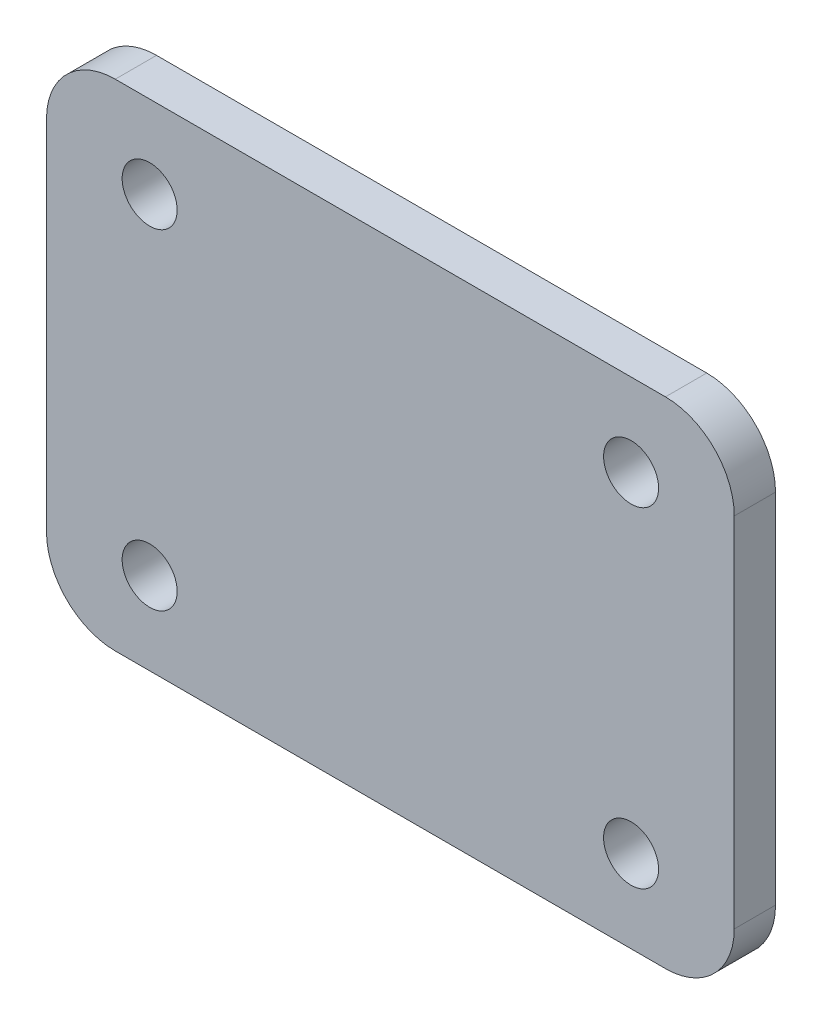
ISO-10303-21;
HEADER;
FILE_DESCRIPTION(('STEP AP214'),'2;1');
FILE_NAME('part.step','',(''),(''),'','','');
FILE_SCHEMA(('AUTOMOTIVE_DESIGN { 1 0 10303 214 1 1 1 1 }'));
ENDSEC;
DATA;
#1=APPLICATION_CONTEXT('core data for automotive mechanical design processes');
#2=APPLICATION_PROTOCOL_DEFINITION('international standard','automotive_design',2000,#1);
#3=PRODUCT_CONTEXT('',#1,'mechanical');
#4=PRODUCT('Part','Part','',(#3));
#5=PRODUCT_RELATED_PRODUCT_CATEGORY('part','',(#4));
#6=PRODUCT_DEFINITION_FORMATION('','',#4);
#7=PRODUCT_DEFINITION_CONTEXT('part definition',#1,'design');
#8=PRODUCT_DEFINITION('design','',#6,#7);
#9=PRODUCT_DEFINITION_SHAPE('','',#8);
#10=(LENGTH_UNIT() NAMED_UNIT(*) SI_UNIT(.MILLI.,.METRE.));
#11=(NAMED_UNIT(*) PLANE_ANGLE_UNIT() SI_UNIT($,.RADIAN.));
#12=(NAMED_UNIT(*) SI_UNIT($,.STERADIAN.) SOLID_ANGLE_UNIT());
#13=UNCERTAINTY_MEASURE_WITH_UNIT(LENGTH_MEASURE(1.E-05),#10,'distance_accuracy_value','');
#14=(GEOMETRIC_REPRESENTATION_CONTEXT(3) GLOBAL_UNCERTAINTY_ASSIGNED_CONTEXT((#13)) GLOBAL_UNIT_ASSIGNED_CONTEXT((#10,
#11,#12)) REPRESENTATION_CONTEXT('',''));
#15=CARTESIAN_POINT('',(0.,0.,0.));
#16=DIRECTION('',(0.,0.,1.));
#17=DIRECTION('',(1.,0.,0.));
#18=AXIS2_PLACEMENT_3D('',#15,#16,#17);
#19=CARTESIAN_POINT('',(0.,0.,3.));
#20=DIRECTION('',(0.,0.,1.));
#21=DIRECTION('',(1.,0.,0.));
#22=AXIS2_PLACEMENT_3D('',#19,#20,#21);
#23=PLANE('',#22);
#24=CARTESIAN_POINT('',(17.5,12.,3.));
#25=DIRECTION('',(0.,0.,1.));
#26=DIRECTION('',(1.,0.,0.));
#27=AXIS2_PLACEMENT_3D('',#24,#25,#26);
#28=CIRCLE('',#27,2.);
#29=CARTESIAN_POINT('',(19.5,12.,3.));
#30=VERTEX_POINT('',#29);
#31=EDGE_CURVE('E194',#30,#30,#28,.T.);
#32=ORIENTED_EDGE('',*,*,#31,.F.);
#33=EDGE_LOOP('',(#32));
#34=FACE_BOUND('',#33,.T.);
#35=CARTESIAN_POINT('',(17.5,-12.,3.));
#36=DIRECTION('',(0.,0.,1.));
#37=DIRECTION('',(1.,0.,0.));
#38=AXIS2_PLACEMENT_3D('',#35,#36,#37);
#39=CIRCLE('',#38,2.);
#40=CARTESIAN_POINT('',(19.5,-12.,3.));
#41=VERTEX_POINT('',#40);
#42=EDGE_CURVE('E135',#41,#41,#39,.T.);
#43=ORIENTED_EDGE('',*,*,#42,.F.);
#44=EDGE_LOOP('',(#43));
#45=FACE_BOUND('',#44,.T.);
#46=DIRECTION('',(1.,0.,0.));
#47=VECTOR('',#46,1.);
#48=CARTESIAN_POINT('',(-25.,-18.,3.));
#49=LINE('',#48,#47);
#50=CARTESIAN_POINT('',(-20.,-18.,3.));
#51=VERTEX_POINT('',#50);
#52=CARTESIAN_POINT('',(20.,-18.,3.));
#53=VERTEX_POINT('',#52);
#54=EDGE_CURVE('E144',#51,#53,#49,.T.);
#55=ORIENTED_EDGE('',*,*,#54,.T.);
#56=CARTESIAN_POINT('',(20.,-13.,3.));
#57=DIRECTION('',(0.,0.,1.));
#58=DIRECTION('',(1.,0.,0.));
#59=AXIS2_PLACEMENT_3D('',#56,#57,#58);
#60=CIRCLE('',#59,5.);
#61=CARTESIAN_POINT('',(25.,-13.,3.));
#62=VERTEX_POINT('',#61);
#63=EDGE_CURVE('E163',#53,#62,#60,.T.);
#64=ORIENTED_EDGE('',*,*,#63,.T.);
#65=DIRECTION('',(0.,1.,0.));
#66=VECTOR('',#65,1.);
#67=CARTESIAN_POINT('',(25.,-18.,3.));
#68=LINE('',#67,#66);
#69=CARTESIAN_POINT('',(25.,13.,3.));
#70=VERTEX_POINT('',#69);
#71=EDGE_CURVE('E127',#62,#70,#68,.T.);
#72=ORIENTED_EDGE('',*,*,#71,.T.);
#73=CARTESIAN_POINT('',(20.,13.,3.));
#74=DIRECTION('',(0.,0.,1.));
#75=DIRECTION('',(1.,0.,0.));
#76=AXIS2_PLACEMENT_3D('',#73,#74,#75);
#77=CIRCLE('',#76,5.);
#78=CARTESIAN_POINT('',(20.,18.,3.));
#79=VERTEX_POINT('',#78);
#80=EDGE_CURVE('E158',#70,#79,#77,.T.);
#81=ORIENTED_EDGE('',*,*,#80,.T.);
#82=DIRECTION('',(-1.,0.,0.));
#83=VECTOR('',#82,1.);
#84=CARTESIAN_POINT('',(25.,18.,3.));
#85=LINE('',#84,#83);
#86=CARTESIAN_POINT('',(-20.,18.,3.));
#87=VERTEX_POINT('',#86);
#88=EDGE_CURVE('E174',#79,#87,#85,.T.);
#89=ORIENTED_EDGE('',*,*,#88,.T.);
#90=CARTESIAN_POINT('',(-20.,13.,3.));
#91=DIRECTION('',(0.,0.,1.));
#92=DIRECTION('',(1.,0.,0.));
#93=AXIS2_PLACEMENT_3D('',#90,#91,#92);
#94=CIRCLE('',#93,5.);
#95=CARTESIAN_POINT('',(-25.,13.,3.));
#96=VERTEX_POINT('',#95);
#97=EDGE_CURVE('E63',#87,#96,#94,.T.);
#98=ORIENTED_EDGE('',*,*,#97,.T.);
#99=DIRECTION('',(0.,-1.,0.));
#100=VECTOR('',#99,1.);
#101=CARTESIAN_POINT('',(-25.,18.,3.));
#102=LINE('',#101,#100);
#103=CARTESIAN_POINT('',(-25.,-13.,3.));
#104=VERTEX_POINT('',#103);
#105=EDGE_CURVE('E182',#96,#104,#102,.T.);
#106=ORIENTED_EDGE('',*,*,#105,.T.);
#107=CARTESIAN_POINT('',(-20.,-13.,3.));
#108=DIRECTION('',(0.,0.,1.));
#109=DIRECTION('',(1.,0.,0.));
#110=AXIS2_PLACEMENT_3D('',#107,#108,#109);
#111=CIRCLE('',#110,5.);
#112=EDGE_CURVE('E161',#104,#51,#111,.T.);
#113=ORIENTED_EDGE('',*,*,#112,.T.);
#114=EDGE_LOOP('',(#55,#64,#72,#81,#89,#98,#106,#113));
#115=FACE_BOUND('',#114,.T.);
#116=CARTESIAN_POINT('',(-17.5,-12.,3.));
#117=DIRECTION('',(0.,0.,1.));
#118=DIRECTION('',(1.,0.,0.));
#119=AXIS2_PLACEMENT_3D('',#116,#117,#118);
#120=CIRCLE('',#119,2.00000000000001);
#121=CARTESIAN_POINT('',(-15.5,-12.,3.));
#122=VERTEX_POINT('',#121);
#123=EDGE_CURVE('E189',#122,#122,#120,.T.);
#124=ORIENTED_EDGE('',*,*,#123,.F.);
#125=EDGE_LOOP('',(#124));
#126=FACE_BOUND('',#125,.T.);
#127=CARTESIAN_POINT('',(-17.5,12.,3.));
#128=DIRECTION('',(0.,0.,1.));
#129=DIRECTION('',(1.,0.,0.));
#130=AXIS2_PLACEMENT_3D('',#127,#128,#129);
#131=CIRCLE('',#130,2.);
#132=CARTESIAN_POINT('',(-15.5,12.,3.));
#133=VERTEX_POINT('',#132);
#134=EDGE_CURVE('E200',#133,#133,#131,.T.);
#135=ORIENTED_EDGE('',*,*,#134,.F.);
#136=EDGE_LOOP('',(#135));
#137=FACE_BOUND('',#136,.T.);
#138=ADVANCED_FACE('F41',(#34,#45,#115,#126,#137),#23,.T.);
#139=CARTESIAN_POINT('',(0.,0.,0.));
#140=DIRECTION('',(0.,0.,1.));
#141=DIRECTION('',(1.,0.,0.));
#142=AXIS2_PLACEMENT_3D('',#139,#140,#141);
#143=PLANE('',#142);
#144=DIRECTION('',(0.,1.,0.));
#145=VECTOR('',#144,1.);
#146=CARTESIAN_POINT('',(25.,-18.,0.));
#147=LINE('',#146,#145);
#148=CARTESIAN_POINT('',(25.,-13.,0.));
#149=VERTEX_POINT('',#148);
#150=CARTESIAN_POINT('',(25.,13.,0.));
#151=VERTEX_POINT('',#150);
#152=EDGE_CURVE('E124',#149,#151,#147,.T.);
#153=ORIENTED_EDGE('',*,*,#152,.F.);
#154=CARTESIAN_POINT('',(20.,-13.,0.));
#155=DIRECTION('',(0.,0.,1.));
#156=DIRECTION('',(1.,0.,0.));
#157=AXIS2_PLACEMENT_3D('',#154,#155,#156);
#158=CIRCLE('',#157,5.);
#159=CARTESIAN_POINT('',(20.,-18.,0.));
#160=VERTEX_POINT('',#159);
#161=EDGE_CURVE('E107',#149,#160,#158,.F.);
#162=ORIENTED_EDGE('',*,*,#161,.T.);
#163=DIRECTION('',(1.,0.,0.));
#164=VECTOR('',#163,1.);
#165=CARTESIAN_POINT('',(-25.,-18.,0.));
#166=LINE('',#165,#164);
#167=CARTESIAN_POINT('',(-20.,-18.,0.));
#168=VERTEX_POINT('',#167);
#169=EDGE_CURVE('E148',#168,#160,#166,.T.);
#170=ORIENTED_EDGE('',*,*,#169,.F.);
#171=CARTESIAN_POINT('',(-20.,-13.,0.));
#172=DIRECTION('',(0.,0.,1.));
#173=DIRECTION('',(1.,0.,0.));
#174=AXIS2_PLACEMENT_3D('',#171,#172,#173);
#175=CIRCLE('',#174,5.);
#176=CARTESIAN_POINT('',(-25.,-13.,0.));
#177=VERTEX_POINT('',#176);
#178=EDGE_CURVE('E118',#168,#177,#175,.F.);
#179=ORIENTED_EDGE('',*,*,#178,.T.);
#180=DIRECTION('',(0.,-1.,0.));
#181=VECTOR('',#180,1.);
#182=CARTESIAN_POINT('',(-25.,18.,0.));
#183=LINE('',#182,#181);
#184=CARTESIAN_POINT('',(-25.,13.,0.));
#185=VERTEX_POINT('',#184);
#186=EDGE_CURVE('E138',#185,#177,#183,.T.);
#187=ORIENTED_EDGE('',*,*,#186,.F.);
#188=CARTESIAN_POINT('',(-20.,13.,0.));
#189=DIRECTION('',(0.,0.,1.));
#190=DIRECTION('',(1.,0.,0.));
#191=AXIS2_PLACEMENT_3D('',#188,#189,#190);
#192=CIRCLE('',#191,5.);
#193=CARTESIAN_POINT('',(-20.,18.,0.));
#194=VERTEX_POINT('',#193);
#195=EDGE_CURVE('E152',#185,#194,#192,.F.);
#196=ORIENTED_EDGE('',*,*,#195,.T.);
#197=DIRECTION('',(-1.,0.,0.));
#198=VECTOR('',#197,1.);
#199=CARTESIAN_POINT('',(25.,18.,0.));
#200=LINE('',#199,#198);
#201=CARTESIAN_POINT('',(20.,18.,0.));
#202=VERTEX_POINT('',#201);
#203=EDGE_CURVE('E134',#202,#194,#200,.T.);
#204=ORIENTED_EDGE('',*,*,#203,.F.);
#205=CARTESIAN_POINT('',(20.,13.,0.));
#206=DIRECTION('',(0.,0.,1.));
#207=DIRECTION('',(1.,0.,0.));
#208=AXIS2_PLACEMENT_3D('',#205,#206,#207);
#209=CIRCLE('',#208,5.);
#210=EDGE_CURVE('E128',#202,#151,#209,.F.);
#211=ORIENTED_EDGE('',*,*,#210,.T.);
#212=EDGE_LOOP('',(#153,#162,#170,#179,#187,#196,#204,#211));
#213=FACE_BOUND('',#212,.T.);
#214=CARTESIAN_POINT('',(17.5,-12.,0.));
#215=DIRECTION('',(0.,0.,1.));
#216=DIRECTION('',(1.,0.,0.));
#217=AXIS2_PLACEMENT_3D('',#214,#215,#216);
#218=CIRCLE('',#217,2.);
#219=CARTESIAN_POINT('',(19.5,-12.,0.));
#220=VERTEX_POINT('',#219);
#221=EDGE_CURVE('E141',#220,#220,#218,.T.);
#222=ORIENTED_EDGE('',*,*,#221,.T.);
#223=EDGE_LOOP('',(#222));
#224=FACE_BOUND('',#223,.T.);
#225=CARTESIAN_POINT('',(-17.5,-12.,0.));
#226=DIRECTION('',(0.,0.,1.));
#227=DIRECTION('',(1.,0.,0.));
#228=AXIS2_PLACEMENT_3D('',#225,#226,#227);
#229=CIRCLE('',#228,2.00000000000001);
#230=CARTESIAN_POINT('',(-15.5,-12.,0.));
#231=VERTEX_POINT('',#230);
#232=EDGE_CURVE('E191',#231,#231,#229,.T.);
#233=ORIENTED_EDGE('',*,*,#232,.T.);
#234=EDGE_LOOP('',(#233));
#235=FACE_BOUND('',#234,.T.);
#236=CARTESIAN_POINT('',(17.5,12.,0.));
#237=DIRECTION('',(0.,0.,1.));
#238=DIRECTION('',(1.,0.,0.));
#239=AXIS2_PLACEMENT_3D('',#236,#237,#238);
#240=CIRCLE('',#239,2.);
#241=CARTESIAN_POINT('',(19.5,12.,0.));
#242=VERTEX_POINT('',#241);
#243=EDGE_CURVE('E197',#242,#242,#240,.T.);
#244=ORIENTED_EDGE('',*,*,#243,.T.);
#245=EDGE_LOOP('',(#244));
#246=FACE_BOUND('',#245,.T.);
#247=CARTESIAN_POINT('',(-17.5,12.,0.));
#248=DIRECTION('',(0.,0.,1.));
#249=DIRECTION('',(1.,0.,0.));
#250=AXIS2_PLACEMENT_3D('',#247,#248,#249);
#251=CIRCLE('',#250,2.);
#252=CARTESIAN_POINT('',(-15.5,12.,0.));
#253=VERTEX_POINT('',#252);
#254=EDGE_CURVE('E203',#253,#253,#251,.T.);
#255=ORIENTED_EDGE('',*,*,#254,.T.);
#256=EDGE_LOOP('',(#255));
#257=FACE_BOUND('',#256,.T.);
#258=ADVANCED_FACE('F131',(#213,#224,#235,#246,#257),#143,.F.);
#259=CARTESIAN_POINT('',(25.,-18.,3.));
#260=DIRECTION('',(-1.,0.,0.));
#261=DIRECTION('',(0.,0.,1.));
#262=AXIS2_PLACEMENT_3D('',#259,#260,#261);
#263=PLANE('',#262);
#264=ORIENTED_EDGE('',*,*,#71,.F.);
#265=DIRECTION('',(0.,0.,-1.));
#266=VECTOR('',#265,1.);
#267=CARTESIAN_POINT('',(25.,-13.,3.));
#268=LINE('',#267,#266);
#269=EDGE_CURVE('E111',#62,#149,#268,.T.);
#270=ORIENTED_EDGE('',*,*,#269,.T.);
#271=ORIENTED_EDGE('',*,*,#152,.T.);
#272=DIRECTION('',(0.,0.,-1.));
#273=VECTOR('',#272,1.);
#274=CARTESIAN_POINT('',(25.,13.,3.));
#275=LINE('',#274,#273);
#276=EDGE_CURVE('E129',#151,#70,#275,.F.);
#277=ORIENTED_EDGE('',*,*,#276,.T.);
#278=EDGE_LOOP('',(#264,#270,#271,#277));
#279=FACE_BOUND('',#278,.T.);
#280=ADVANCED_FACE('F123',(#279),#263,.F.);
#281=CARTESIAN_POINT('',(25.,18.,3.));
#282=DIRECTION('',(0.,-1.,0.));
#283=DIRECTION('',(0.,0.,-1.));
#284=AXIS2_PLACEMENT_3D('',#281,#282,#283);
#285=PLANE('',#284);
#286=ORIENTED_EDGE('',*,*,#203,.T.);
#287=DIRECTION('',(0.,0.,-1.));
#288=VECTOR('',#287,1.);
#289=CARTESIAN_POINT('',(-20.,18.,3.));
#290=LINE('',#289,#288);
#291=EDGE_CURVE('E11',#194,#87,#290,.F.);
#292=ORIENTED_EDGE('',*,*,#291,.T.);
#293=ORIENTED_EDGE('',*,*,#88,.F.);
#294=DIRECTION('',(0.,0.,-1.));
#295=VECTOR('',#294,1.);
#296=CARTESIAN_POINT('',(20.,18.,3.));
#297=LINE('',#296,#295);
#298=EDGE_CURVE('E49',#79,#202,#297,.T.);
#299=ORIENTED_EDGE('',*,*,#298,.T.);
#300=EDGE_LOOP('',(#286,#292,#293,#299));
#301=FACE_BOUND('',#300,.T.);
#302=ADVANCED_FACE('F172',(#301),#285,.F.);
#303=CARTESIAN_POINT('',(-25.,18.,3.));
#304=DIRECTION('',(1.,0.,0.));
#305=DIRECTION('',(0.,0.,-1.));
#306=AXIS2_PLACEMENT_3D('',#303,#304,#305);
#307=PLANE('',#306);
#308=ORIENTED_EDGE('',*,*,#186,.T.);
#309=DIRECTION('',(0.,0.,-1.));
#310=VECTOR('',#309,1.);
#311=CARTESIAN_POINT('',(-25.,-13.,3.));
#312=LINE('',#311,#310);
#313=EDGE_CURVE('E56',#177,#104,#312,.F.);
#314=ORIENTED_EDGE('',*,*,#313,.T.);
#315=ORIENTED_EDGE('',*,*,#105,.F.);
#316=DIRECTION('',(0.,0.,-1.));
#317=VECTOR('',#316,1.);
#318=CARTESIAN_POINT('',(-25.,13.,3.));
#319=LINE('',#318,#317);
#320=EDGE_CURVE('E165',#96,#185,#319,.T.);
#321=ORIENTED_EDGE('',*,*,#320,.T.);
#322=EDGE_LOOP('',(#308,#314,#315,#321));
#323=FACE_BOUND('',#322,.T.);
#324=ADVANCED_FACE('F181',(#323),#307,.F.);
#325=CARTESIAN_POINT('',(-25.,-18.,3.));
#326=DIRECTION('',(0.,1.,0.));
#327=DIRECTION('',(0.,0.,1.));
#328=AXIS2_PLACEMENT_3D('',#325,#326,#327);
#329=PLANE('',#328);
#330=ORIENTED_EDGE('',*,*,#169,.T.);
#331=DIRECTION('',(0.,0.,-1.));
#332=VECTOR('',#331,1.);
#333=CARTESIAN_POINT('',(20.,-18.,3.));
#334=LINE('',#333,#332);
#335=EDGE_CURVE('E112',#160,#53,#334,.F.);
#336=ORIENTED_EDGE('',*,*,#335,.T.);
#337=ORIENTED_EDGE('',*,*,#54,.F.);
#338=DIRECTION('',(0.,0.,-1.));
#339=VECTOR('',#338,1.);
#340=CARTESIAN_POINT('',(-20.,-18.,3.));
#341=LINE('',#340,#339);
#342=EDGE_CURVE('E117',#51,#168,#341,.T.);
#343=ORIENTED_EDGE('',*,*,#342,.T.);
#344=EDGE_LOOP('',(#330,#336,#337,#343));
#345=FACE_BOUND('',#344,.T.);
#346=ADVANCED_FACE('F226',(#345),#329,.F.);
#347=CARTESIAN_POINT('',(17.5,-12.,3.));
#348=DIRECTION('',(0.,0.,-1.));
#349=DIRECTION('',(-1.,0.,0.));
#350=AXIS2_PLACEMENT_3D('',#347,#348,#349);
#351=CYLINDRICAL_SURFACE('',#350,2.);
#352=ORIENTED_EDGE('',*,*,#42,.T.);
#353=EDGE_LOOP('',(#352));
#354=FACE_BOUND('',#353,.T.);
#355=ORIENTED_EDGE('',*,*,#221,.F.);
#356=EDGE_LOOP('',(#355));
#357=FACE_BOUND('',#356,.T.);
#358=ADVANCED_FACE('F223',(#354,#357),#351,.F.);
#359=CARTESIAN_POINT('',(-17.5,-12.,3.));
#360=DIRECTION('',(0.,0.,-1.));
#361=DIRECTION('',(-1.,0.,0.));
#362=AXIS2_PLACEMENT_3D('',#359,#360,#361);
#363=CYLINDRICAL_SURFACE('',#362,2.00000000000001);
#364=ORIENTED_EDGE('',*,*,#123,.T.);
#365=EDGE_LOOP('',(#364));
#366=FACE_BOUND('',#365,.T.);
#367=ORIENTED_EDGE('',*,*,#232,.F.);
#368=EDGE_LOOP('',(#367));
#369=FACE_BOUND('',#368,.T.);
#370=ADVANCED_FACE('F252',(#366,#369),#363,.F.);
#371=CARTESIAN_POINT('',(17.5,12.,3.));
#372=DIRECTION('',(0.,0.,-1.));
#373=DIRECTION('',(-1.,0.,0.));
#374=AXIS2_PLACEMENT_3D('',#371,#372,#373);
#375=CYLINDRICAL_SURFACE('',#374,2.);
#376=ORIENTED_EDGE('',*,*,#31,.T.);
#377=EDGE_LOOP('',(#376));
#378=FACE_BOUND('',#377,.T.);
#379=ORIENTED_EDGE('',*,*,#243,.F.);
#380=EDGE_LOOP('',(#379));
#381=FACE_BOUND('',#380,.T.);
#382=ADVANCED_FACE('F255',(#378,#381),#375,.F.);
#383=CARTESIAN_POINT('',(-17.5,12.,3.));
#384=DIRECTION('',(0.,0.,-1.));
#385=DIRECTION('',(-1.,0.,0.));
#386=AXIS2_PLACEMENT_3D('',#383,#384,#385);
#387=CYLINDRICAL_SURFACE('',#386,2.);
#388=ORIENTED_EDGE('',*,*,#134,.T.);
#389=EDGE_LOOP('',(#388));
#390=FACE_BOUND('',#389,.T.);
#391=ORIENTED_EDGE('',*,*,#254,.F.);
#392=EDGE_LOOP('',(#391));
#393=FACE_BOUND('',#392,.T.);
#394=ADVANCED_FACE('F209',(#390,#393),#387,.F.);
#395=CARTESIAN_POINT('',(20.,-13.,3.));
#396=DIRECTION('',(0.,0.,-1.));
#397=DIRECTION('',(-1.,0.,0.));
#398=AXIS2_PLACEMENT_3D('',#395,#396,#397);
#399=CYLINDRICAL_SURFACE('',#398,5.);
#400=ORIENTED_EDGE('',*,*,#63,.F.);
#401=ORIENTED_EDGE('',*,*,#335,.F.);
#402=ORIENTED_EDGE('',*,*,#161,.F.);
#403=ORIENTED_EDGE('',*,*,#269,.F.);
#404=EDGE_LOOP('',(#400,#401,#402,#403));
#405=FACE_BOUND('',#404,.T.);
#406=ADVANCED_FACE('F110',(#405),#399,.T.);
#407=CARTESIAN_POINT('',(-20.,-13.,3.));
#408=DIRECTION('',(0.,0.,-1.));
#409=DIRECTION('',(-1.,0.,0.));
#410=AXIS2_PLACEMENT_3D('',#407,#408,#409);
#411=CYLINDRICAL_SURFACE('',#410,5.);
#412=ORIENTED_EDGE('',*,*,#112,.F.);
#413=ORIENTED_EDGE('',*,*,#313,.F.);
#414=ORIENTED_EDGE('',*,*,#178,.F.);
#415=ORIENTED_EDGE('',*,*,#342,.F.);
#416=EDGE_LOOP('',(#412,#413,#414,#415));
#417=FACE_BOUND('',#416,.T.);
#418=ADVANCED_FACE('F238',(#417),#411,.T.);
#419=CARTESIAN_POINT('',(-20.,13.,3.));
#420=DIRECTION('',(0.,0.,-1.));
#421=DIRECTION('',(-1.,0.,0.));
#422=AXIS2_PLACEMENT_3D('',#419,#420,#421);
#423=CYLINDRICAL_SURFACE('',#422,5.);
#424=ORIENTED_EDGE('',*,*,#97,.F.);
#425=ORIENTED_EDGE('',*,*,#291,.F.);
#426=ORIENTED_EDGE('',*,*,#195,.F.);
#427=ORIENTED_EDGE('',*,*,#320,.F.);
#428=EDGE_LOOP('',(#424,#425,#426,#427));
#429=FACE_BOUND('',#428,.T.);
#430=ADVANCED_FACE('F180',(#429),#423,.T.);
#431=CARTESIAN_POINT('',(20.,13.,3.));
#432=DIRECTION('',(0.,0.,-1.));
#433=DIRECTION('',(-1.,0.,0.));
#434=AXIS2_PLACEMENT_3D('',#431,#432,#433);
#435=CYLINDRICAL_SURFACE('',#434,5.);
#436=ORIENTED_EDGE('',*,*,#80,.F.);
#437=ORIENTED_EDGE('',*,*,#276,.F.);
#438=ORIENTED_EDGE('',*,*,#210,.F.);
#439=ORIENTED_EDGE('',*,*,#298,.F.);
#440=EDGE_LOOP('',(#436,#437,#438,#439));
#441=FACE_BOUND('',#440,.T.);
#442=ADVANCED_FACE('F43',(#441),#435,.T.);
#443=CLOSED_SHELL('',(#138,#258,#280,#302,#324,#346,#358,#370,#382,#394,#406,#418,#430,#442));
#444=MANIFOLD_SOLID_BREP('B2',#443);
#445=ADVANCED_BREP_SHAPE_REPRESENTATION('',(#18,#444),#14);
#446=SHAPE_DEFINITION_REPRESENTATION(#9,#445);
ENDSEC;
END-ISO-10303-21;
